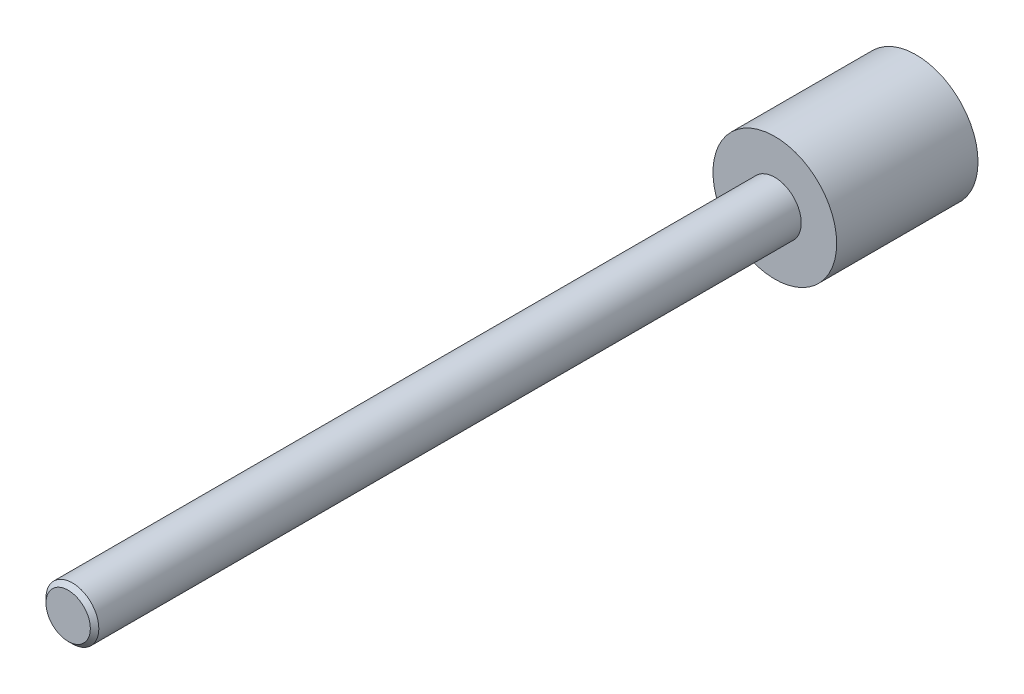
ISO-10303-21;
HEADER;
FILE_DESCRIPTION(('STEP AP214'),'2;1');
FILE_NAME('part.step','',(''),(''),'','','');
FILE_SCHEMA(('AUTOMOTIVE_DESIGN { 1 0 10303 214 1 1 1 1 }'));
ENDSEC;
DATA;
#1=APPLICATION_CONTEXT('core data for automotive mechanical design processes');
#2=APPLICATION_PROTOCOL_DEFINITION('international standard','automotive_design',2000,#1);
#3=PRODUCT_CONTEXT('',#1,'mechanical');
#4=PRODUCT('Part','Part','',(#3));
#5=PRODUCT_RELATED_PRODUCT_CATEGORY('part','',(#4));
#6=PRODUCT_DEFINITION_FORMATION('','',#4);
#7=PRODUCT_DEFINITION_CONTEXT('part definition',#1,'design');
#8=PRODUCT_DEFINITION('design','',#6,#7);
#9=PRODUCT_DEFINITION_SHAPE('','',#8);
#10=(LENGTH_UNIT() NAMED_UNIT(*) SI_UNIT(.MILLI.,.METRE.));
#11=(NAMED_UNIT(*) PLANE_ANGLE_UNIT() SI_UNIT($,.RADIAN.));
#12=(NAMED_UNIT(*) SI_UNIT($,.STERADIAN.) SOLID_ANGLE_UNIT());
#13=UNCERTAINTY_MEASURE_WITH_UNIT(LENGTH_MEASURE(1.E-05),#10,'distance_accuracy_value','');
#14=(GEOMETRIC_REPRESENTATION_CONTEXT(3) GLOBAL_UNCERTAINTY_ASSIGNED_CONTEXT((#13)) GLOBAL_UNIT_ASSIGNED_CONTEXT((#10,
#11,#12)) REPRESENTATION_CONTEXT('',''));
#15=CARTESIAN_POINT('',(0.,0.,0.));
#16=DIRECTION('',(0.,0.,1.));
#17=DIRECTION('',(1.,0.,0.));
#18=AXIS2_PLACEMENT_3D('',#15,#16,#17);
#19=CARTESIAN_POINT('',(0.,0.,-63.5));
#20=DIRECTION('',(0.,0.,1.));
#21=DIRECTION('',(1.,0.,0.));
#22=AXIS2_PLACEMENT_3D('',#19,#20,#21);
#23=PLANE('',#22);
#24=CARTESIAN_POINT('',(0.,0.,-63.5));
#25=DIRECTION('',(0.,0.,1.));
#26=DIRECTION('',(1.,0.,0.));
#27=AXIS2_PLACEMENT_3D('',#24,#25,#26);
#28=CIRCLE('',#27,5.55625);
#29=CARTESIAN_POINT('',(5.55625,0.,-63.5));
#30=VERTEX_POINT('',#29);
#31=EDGE_CURVE('E25',#30,#30,#28,.T.);
#32=ORIENTED_EDGE('',*,*,#31,.F.);
#33=EDGE_LOOP('',(#32));
#34=FACE_BOUND('',#33,.T.);
#35=ADVANCED_FACE('F16',(#34),#23,.F.);
#36=CARTESIAN_POINT('',(0.,0.,-50.8));
#37=DIRECTION('',(0.,0.,1.));
#38=DIRECTION('',(1.,0.,0.));
#39=AXIS2_PLACEMENT_3D('',#36,#37,#38);
#40=PLANE('',#39);
#41=CARTESIAN_POINT('',(0.,0.,-50.8));
#42=DIRECTION('',(0.,0.,1.));
#43=DIRECTION('',(1.,0.,0.));
#44=AXIS2_PLACEMENT_3D('',#41,#42,#43);
#45=CIRCLE('',#44,2.3749);
#46=CARTESIAN_POINT('',(2.3749,0.,-50.8));
#47=VERTEX_POINT('',#46);
#48=EDGE_CURVE('E10',#47,#47,#45,.T.);
#49=ORIENTED_EDGE('',*,*,#48,.F.);
#50=EDGE_LOOP('',(#49));
#51=FACE_BOUND('',#50,.T.);
#52=CARTESIAN_POINT('',(0.,0.,-50.8));
#53=DIRECTION('',(0.,0.,1.));
#54=DIRECTION('',(1.,0.,0.));
#55=AXIS2_PLACEMENT_3D('',#52,#53,#54);
#56=CIRCLE('',#55,5.55625);
#57=CARTESIAN_POINT('',(5.55625,0.,-50.8));
#58=VERTEX_POINT('',#57);
#59=EDGE_CURVE('E63',#58,#58,#56,.T.);
#60=ORIENTED_EDGE('',*,*,#59,.T.);
#61=EDGE_LOOP('',(#60));
#62=FACE_BOUND('',#61,.T.);
#63=ADVANCED_FACE('F73',(#51,#62),#40,.T.);
#64=CARTESIAN_POINT('',(0.,0.,12.7));
#65=DIRECTION('',(0.,0.,1.));
#66=DIRECTION('',(1.,0.,0.));
#67=AXIS2_PLACEMENT_3D('',#64,#65,#66);
#68=PLANE('',#67);
#69=CARTESIAN_POINT('',(0.,0.,12.7));
#70=DIRECTION('',(0.,0.,1.));
#71=DIRECTION('',(1.,0.,0.));
#72=AXIS2_PLACEMENT_3D('',#69,#70,#71);
#73=CIRCLE('',#72,1.9939);
#74=CARTESIAN_POINT('',(1.9939,0.,12.7));
#75=VERTEX_POINT('',#74);
#76=EDGE_CURVE('E56',#75,#75,#73,.T.);
#77=ORIENTED_EDGE('',*,*,#76,.T.);
#78=EDGE_LOOP('',(#77));
#79=FACE_BOUND('',#78,.T.);
#80=ADVANCED_FACE('F18',(#79),#68,.T.);
#81=CARTESIAN_POINT('',(0.,0.,19.4172315785597));
#82=DIRECTION('',(0.,0.,-1.));
#83=DIRECTION('',(-1.,0.,0.));
#84=AXIS2_PLACEMENT_3D('',#81,#82,#83);
#85=CYLINDRICAL_SURFACE('',#84,2.3749);
#86=ORIENTED_EDGE('',*,*,#48,.T.);
#87=EDGE_LOOP('',(#86));
#88=FACE_BOUND('',#87,.T.);
#89=CARTESIAN_POINT('',(0.,0.,12.319));
#90=DIRECTION('',(0.,0.,-1.));
#91=DIRECTION('',(1.,0.,0.));
#92=AXIS2_PLACEMENT_3D('',#89,#90,#91);
#93=CIRCLE('',#92,2.3749);
#94=CARTESIAN_POINT('',(2.3749,0.,12.319));
#95=VERTEX_POINT('',#94);
#96=EDGE_CURVE('E59',#95,#95,#93,.T.);
#97=ORIENTED_EDGE('',*,*,#96,.T.);
#98=EDGE_LOOP('',(#97));
#99=FACE_BOUND('',#98,.T.);
#100=ADVANCED_FACE('F78',(#88,#99),#85,.T.);
#101=CARTESIAN_POINT('',(0.,0.,-50.8));
#102=DIRECTION('',(0.,0.,-1.));
#103=DIRECTION('',(-1.,0.,0.));
#104=AXIS2_PLACEMENT_3D('',#101,#102,#103);
#105=CYLINDRICAL_SURFACE('',#104,5.55625);
#106=ORIENTED_EDGE('',*,*,#31,.T.);
#107=EDGE_LOOP('',(#106));
#108=FACE_BOUND('',#107,.T.);
#109=ORIENTED_EDGE('',*,*,#59,.F.);
#110=EDGE_LOOP('',(#109));
#111=FACE_BOUND('',#110,.T.);
#112=ADVANCED_FACE('F75',(#108,#111),#105,.T.);
#113=CARTESIAN_POINT('',(0.,0.,12.7));
#114=DIRECTION('',(0.,0.,-1.));
#115=DIRECTION('',(-1.,0.,0.));
#116=AXIS2_PLACEMENT_3D('',#113,#114,#115);
#117=CONICAL_SURFACE('',#116,1.9939,0.785398163397448);
#118=ORIENTED_EDGE('',*,*,#96,.F.);
#119=EDGE_LOOP('',(#118));
#120=FACE_BOUND('',#119,.T.);
#121=ORIENTED_EDGE('',*,*,#76,.F.);
#122=EDGE_LOOP('',(#121));
#123=FACE_BOUND('',#122,.T.);
#124=ADVANCED_FACE('F77',(#120,#123),#117,.T.);
#125=CLOSED_SHELL('',(#35,#63,#80,#100,#112,#124));
#126=MANIFOLD_SOLID_BREP('B1',#125);
#127=ADVANCED_BREP_SHAPE_REPRESENTATION('',(#18,#126),#14);
#128=SHAPE_DEFINITION_REPRESENTATION(#9,#127);
ENDSEC;
END-ISO-10303-21;
